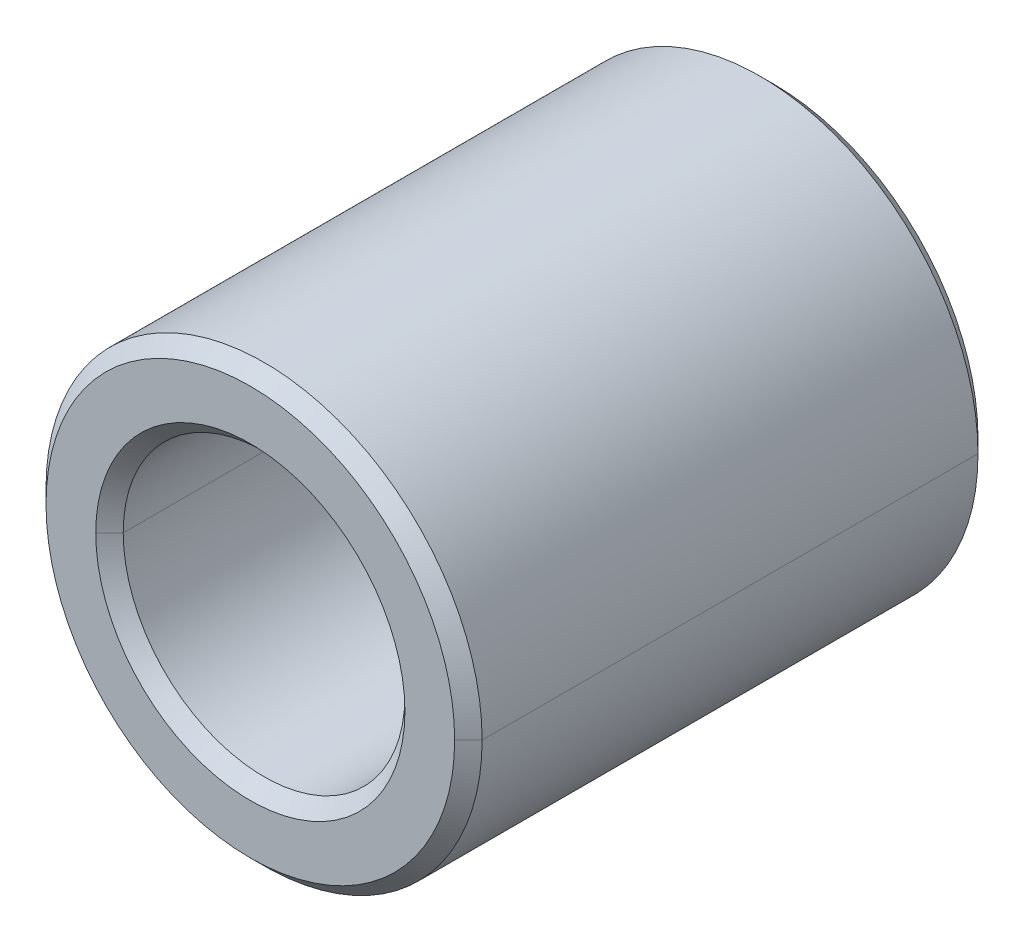
ISO-10303-21;
HEADER;
FILE_DESCRIPTION(('STEP AP214'),'2;1');
FILE_NAME('part.step','',(''),(''),'','','');
FILE_SCHEMA(('AUTOMOTIVE_DESIGN { 1 0 10303 214 1 1 1 1 }'));
ENDSEC;
DATA;
#1=APPLICATION_CONTEXT('core data for automotive mechanical design processes');
#2=APPLICATION_PROTOCOL_DEFINITION('international standard','automotive_design',2000,#1);
#3=PRODUCT_CONTEXT('',#1,'mechanical');
#4=PRODUCT('Part','Part','',(#3));
#5=PRODUCT_RELATED_PRODUCT_CATEGORY('part','',(#4));
#6=PRODUCT_DEFINITION_FORMATION('','',#4);
#7=PRODUCT_DEFINITION_CONTEXT('part definition',#1,'design');
#8=PRODUCT_DEFINITION('design','',#6,#7);
#9=PRODUCT_DEFINITION_SHAPE('','',#8);
#10=(LENGTH_UNIT() NAMED_UNIT(*) SI_UNIT(.MILLI.,.METRE.));
#11=(NAMED_UNIT(*) PLANE_ANGLE_UNIT() SI_UNIT($,.RADIAN.));
#12=(NAMED_UNIT(*) SI_UNIT($,.STERADIAN.) SOLID_ANGLE_UNIT());
#13=UNCERTAINTY_MEASURE_WITH_UNIT(LENGTH_MEASURE(1.E-05),#10,'distance_accuracy_value','');
#14=(GEOMETRIC_REPRESENTATION_CONTEXT(3) GLOBAL_UNCERTAINTY_ASSIGNED_CONTEXT((#13)) GLOBAL_UNIT_ASSIGNED_CONTEXT((#10,
#11,#12)) REPRESENTATION_CONTEXT('',''));
#15=CARTESIAN_POINT('',(0.,0.,0.));
#16=DIRECTION('',(0.,0.,1.));
#17=DIRECTION('',(1.,0.,0.));
#18=AXIS2_PLACEMENT_3D('',#15,#16,#17);
#19=CARTESIAN_POINT('',(0.,0.,9.025));
#20=DIRECTION('',(0.,0.,1.));
#21=DIRECTION('',(1.,0.,0.));
#22=AXIS2_PLACEMENT_3D('',#19,#20,#21);
#23=CONICAL_SURFACE('',#22,5.127,0.785398163397452);
#24=DIRECTION('',(-0.70710678118655,0.,0.707106781186545));
#25=VECTOR('',#24,1.);
#26=CARTESIAN_POINT('',(-5.127,0.,9.025));
#27=LINE('',#26,#25);
#28=CARTESIAN_POINT('',(-5.127,0.,9.025));
#29=VERTEX_POINT('',#28);
#30=CARTESIAN_POINT('',(-5.627,0.,9.525));
#31=VERTEX_POINT('',#30);
#32=EDGE_CURVE('E147',#29,#31,#27,.T.);
#33=ORIENTED_EDGE('',*,*,#32,.F.);
#34=CARTESIAN_POINT('',(0.,0.,9.025));
#35=DIRECTION('',(0.,0.,1.));
#36=DIRECTION('',(1.,0.,0.));
#37=AXIS2_PLACEMENT_3D('',#34,#35,#36);
#38=CIRCLE('',#37,5.127);
#39=CARTESIAN_POINT('',(5.127,0.,9.025));
#40=VERTEX_POINT('',#39);
#41=EDGE_CURVE('E27',#40,#29,#38,.T.);
#42=ORIENTED_EDGE('',*,*,#41,.F.);
#43=DIRECTION('',(0.70710678118655,0.,0.707106781186545));
#44=VECTOR('',#43,1.);
#45=CARTESIAN_POINT('',(5.127,0.,9.025));
#46=LINE('',#45,#44);
#47=CARTESIAN_POINT('',(5.627,0.,9.525));
#48=VERTEX_POINT('',#47);
#49=EDGE_CURVE('E182',#40,#48,#46,.T.);
#50=ORIENTED_EDGE('',*,*,#49,.T.);
#51=CARTESIAN_POINT('',(0.,0.,9.525));
#52=DIRECTION('',(0.,0.,-1.));
#53=DIRECTION('',(1.,0.,0.));
#54=AXIS2_PLACEMENT_3D('',#51,#52,#53);
#55=CIRCLE('',#54,5.627);
#56=EDGE_CURVE('E122',#31,#48,#55,.T.);
#57=ORIENTED_EDGE('',*,*,#56,.F.);
#58=EDGE_LOOP('',(#33,#42,#50,#57));
#59=FACE_BOUND('',#58,.T.);
#60=ADVANCED_FACE('F16',(#59),#23,.F.);
#61=CARTESIAN_POINT('',(0.,0.,9.525));
#62=DIRECTION('',(0.,0.,-1.));
#63=DIRECTION('',(-1.,0.,0.));
#64=AXIS2_PLACEMENT_3D('',#61,#62,#63);
#65=CONICAL_SURFACE('',#64,7.4375,0.785398163397446);
#66=DIRECTION('',(0.707106781186546,0.,-0.707106781186549));
#67=VECTOR('',#66,1.);
#68=CARTESIAN_POINT('',(7.4375,0.,9.525));
#69=LINE('',#68,#67);
#70=CARTESIAN_POINT('',(7.4375,0.,9.525));
#71=VERTEX_POINT('',#70);
#72=CARTESIAN_POINT('',(7.9375,0.,9.025));
#73=VERTEX_POINT('',#72);
#74=EDGE_CURVE('E193',#71,#73,#69,.T.);
#75=ORIENTED_EDGE('',*,*,#74,.F.);
#76=CARTESIAN_POINT('',(0.,0.,9.525));
#77=DIRECTION('',(0.,0.,1.));
#78=DIRECTION('',(1.,0.,0.));
#79=AXIS2_PLACEMENT_3D('',#76,#77,#78);
#80=CIRCLE('',#79,7.4375);
#81=CARTESIAN_POINT('',(-7.4375,0.,9.525));
#82=VERTEX_POINT('',#81);
#83=EDGE_CURVE('E89',#82,#71,#80,.T.);
#84=ORIENTED_EDGE('',*,*,#83,.F.);
#85=DIRECTION('',(-0.707106781186546,0.,-0.707106781186549));
#86=VECTOR('',#85,1.);
#87=CARTESIAN_POINT('',(-7.4375,0.,9.525));
#88=LINE('',#87,#86);
#89=CARTESIAN_POINT('',(-7.9375,0.,9.025));
#90=VERTEX_POINT('',#89);
#91=EDGE_CURVE('E137',#82,#90,#88,.T.);
#92=ORIENTED_EDGE('',*,*,#91,.T.);
#93=CARTESIAN_POINT('',(0.,0.,9.025));
#94=DIRECTION('',(0.,0.,-1.));
#95=DIRECTION('',(1.,0.,0.));
#96=AXIS2_PLACEMENT_3D('',#93,#94,#95);
#97=CIRCLE('',#96,7.9375);
#98=EDGE_CURVE('E99',#73,#90,#97,.T.);
#99=ORIENTED_EDGE('',*,*,#98,.F.);
#100=EDGE_LOOP('',(#75,#84,#92,#99));
#101=FACE_BOUND('',#100,.T.);
#102=ADVANCED_FACE('F318',(#101),#65,.T.);
#103=CARTESIAN_POINT('',(0.,0.,-9.025));
#104=DIRECTION('',(0.,0.,1.));
#105=DIRECTION('',(1.,0.,0.));
#106=AXIS2_PLACEMENT_3D('',#103,#104,#105);
#107=CONICAL_SURFACE('',#106,7.9375,0.785398163397446);
#108=DIRECTION('',(-0.707106781186546,0.,0.707106781186549));
#109=VECTOR('',#108,1.);
#110=CARTESIAN_POINT('',(-7.9375,0.,-9.025));
#111=LINE('',#110,#109);
#112=CARTESIAN_POINT('',(-7.4375,0.,-9.525));
#113=VERTEX_POINT('',#112);
#114=CARTESIAN_POINT('',(-7.9375,0.,-9.025));
#115=VERTEX_POINT('',#114);
#116=EDGE_CURVE('E125',#113,#115,#111,.T.);
#117=ORIENTED_EDGE('',*,*,#116,.F.);
#118=CARTESIAN_POINT('',(0.,0.,-9.525));
#119=DIRECTION('',(0.,0.,-1.));
#120=DIRECTION('',(1.,0.,0.));
#121=AXIS2_PLACEMENT_3D('',#118,#119,#120);
#122=CIRCLE('',#121,7.4375);
#123=CARTESIAN_POINT('',(7.4375,0.,-9.525));
#124=VERTEX_POINT('',#123);
#125=EDGE_CURVE('E110',#124,#113,#122,.T.);
#126=ORIENTED_EDGE('',*,*,#125,.F.);
#127=DIRECTION('',(0.707106781186546,0.,0.707106781186549));
#128=VECTOR('',#127,1.);
#129=CARTESIAN_POINT('',(7.9375,0.,-9.025));
#130=LINE('',#129,#128);
#131=CARTESIAN_POINT('',(7.9375,0.,-9.025));
#132=VERTEX_POINT('',#131);
#133=EDGE_CURVE('E135',#124,#132,#130,.T.);
#134=ORIENTED_EDGE('',*,*,#133,.T.);
#135=CARTESIAN_POINT('',(0.,0.,-9.025));
#136=DIRECTION('',(0.,0.,1.));
#137=DIRECTION('',(1.,0.,0.));
#138=AXIS2_PLACEMENT_3D('',#135,#136,#137);
#139=CIRCLE('',#138,7.9375);
#140=EDGE_CURVE('E127',#115,#132,#139,.T.);
#141=ORIENTED_EDGE('',*,*,#140,.F.);
#142=EDGE_LOOP('',(#117,#126,#134,#141));
#143=FACE_BOUND('',#142,.T.);
#144=ADVANCED_FACE('F126',(#143),#107,.T.);
#145=CARTESIAN_POINT('',(0.,0.,-9.525));
#146=DIRECTION('',(0.,0.,-1.));
#147=DIRECTION('',(-1.,0.,0.));
#148=AXIS2_PLACEMENT_3D('',#145,#146,#147);
#149=CONICAL_SURFACE('',#148,5.627,0.785398163397446);
#150=DIRECTION('',(0.707106781186546,0.,-0.707106781186549));
#151=VECTOR('',#150,1.);
#152=CARTESIAN_POINT('',(5.627,0.,-9.525));
#153=LINE('',#152,#151);
#154=CARTESIAN_POINT('',(5.127,0.,-9.025));
#155=VERTEX_POINT('',#154);
#156=CARTESIAN_POINT('',(5.627,0.,-9.525));
#157=VERTEX_POINT('',#156);
#158=EDGE_CURVE('E178',#155,#157,#153,.T.);
#159=ORIENTED_EDGE('',*,*,#158,.F.);
#160=CARTESIAN_POINT('',(0.,0.,-9.025));
#161=DIRECTION('',(0.,0.,-1.));
#162=DIRECTION('',(1.,0.,0.));
#163=AXIS2_PLACEMENT_3D('',#160,#161,#162);
#164=CIRCLE('',#163,5.127);
#165=CARTESIAN_POINT('',(-5.127,0.,-9.025));
#166=VERTEX_POINT('',#165);
#167=EDGE_CURVE('E11',#166,#155,#164,.T.);
#168=ORIENTED_EDGE('',*,*,#167,.F.);
#169=DIRECTION('',(-0.707106781186546,0.,-0.707106781186549));
#170=VECTOR('',#169,1.);
#171=CARTESIAN_POINT('',(-5.627,0.,-9.525));
#172=LINE('',#171,#170);
#173=CARTESIAN_POINT('',(-5.627,0.,-9.525));
#174=VERTEX_POINT('',#173);
#175=EDGE_CURVE('E161',#166,#174,#172,.T.);
#176=ORIENTED_EDGE('',*,*,#175,.T.);
#177=CARTESIAN_POINT('',(0.,0.,-9.525));
#178=DIRECTION('',(0.,0.,1.));
#179=DIRECTION('',(1.,0.,0.));
#180=AXIS2_PLACEMENT_3D('',#177,#178,#179);
#181=CIRCLE('',#180,5.627);
#182=EDGE_CURVE('E41',#157,#174,#181,.T.);
#183=ORIENTED_EDGE('',*,*,#182,.F.);
#184=EDGE_LOOP('',(#159,#168,#176,#183));
#185=FACE_BOUND('',#184,.T.);
#186=ADVANCED_FACE('F223',(#185),#149,.F.);
#187=CARTESIAN_POINT('',(0.,0.,9.525));
#188=DIRECTION('',(0.,0.,-1.));
#189=DIRECTION('',(-1.,0.,0.));
#190=AXIS2_PLACEMENT_3D('',#187,#188,#189);
#191=CYLINDRICAL_SURFACE('',#190,5.127);
#192=DIRECTION('',(0.,0.,-1.));
#193=VECTOR('',#192,1.);
#194=CARTESIAN_POINT('',(5.127,0.,9.525));
#195=LINE('',#194,#193);
#196=EDGE_CURVE('E160',#40,#155,#195,.T.);
#197=ORIENTED_EDGE('',*,*,#196,.F.);
#198=ORIENTED_EDGE('',*,*,#41,.T.);
#199=DIRECTION('',(0.,0.,-1.));
#200=VECTOR('',#199,1.);
#201=CARTESIAN_POINT('',(-5.127,0.,9.525));
#202=LINE('',#201,#200);
#203=EDGE_CURVE('E156',#29,#166,#202,.T.);
#204=ORIENTED_EDGE('',*,*,#203,.T.);
#205=ORIENTED_EDGE('',*,*,#167,.T.);
#206=EDGE_LOOP('',(#197,#198,#204,#205));
#207=FACE_BOUND('',#206,.T.);
#208=ADVANCED_FACE('F225',(#207),#191,.F.);
#209=CARTESIAN_POINT('',(0.,0.,9.525));
#210=DIRECTION('',(0.,0.,-1.));
#211=DIRECTION('',(-1.,0.,0.));
#212=AXIS2_PLACEMENT_3D('',#209,#210,#211);
#213=CYLINDRICAL_SURFACE('',#212,7.9375);
#214=DIRECTION('',(0.,0.,-1.));
#215=VECTOR('',#214,1.);
#216=CARTESIAN_POINT('',(7.9375,0.,9.525));
#217=LINE('',#216,#215);
#218=EDGE_CURVE('E151',#73,#132,#217,.T.);
#219=ORIENTED_EDGE('',*,*,#218,.F.);
#220=ORIENTED_EDGE('',*,*,#98,.T.);
#221=DIRECTION('',(0.,0.,-1.));
#222=VECTOR('',#221,1.);
#223=CARTESIAN_POINT('',(-7.9375,0.,9.525));
#224=LINE('',#223,#222);
#225=EDGE_CURVE('E155',#90,#115,#224,.T.);
#226=ORIENTED_EDGE('',*,*,#225,.T.);
#227=ORIENTED_EDGE('',*,*,#140,.T.);
#228=EDGE_LOOP('',(#219,#220,#226,#227));
#229=FACE_BOUND('',#228,.T.);
#230=ADVANCED_FACE('F269',(#229),#213,.T.);
#231=CARTESIAN_POINT('',(0.,0.,-9.525));
#232=DIRECTION('',(0.,0.,1.));
#233=DIRECTION('',(1.,0.,0.));
#234=AXIS2_PLACEMENT_3D('',#231,#232,#233);
#235=PLANE('',#234);
#236=CARTESIAN_POINT('',(0.,0.,-9.525));
#237=DIRECTION('',(0.,0.,1.));
#238=DIRECTION('',(1.,0.,0.));
#239=AXIS2_PLACEMENT_3D('',#236,#237,#238);
#240=CIRCLE('',#239,5.627);
#241=EDGE_CURVE('E163',#174,#157,#240,.T.);
#242=ORIENTED_EDGE('',*,*,#241,.T.);
#243=ORIENTED_EDGE('',*,*,#182,.T.);
#244=EDGE_LOOP('',(#242,#243));
#245=FACE_BOUND('',#244,.T.);
#246=ORIENTED_EDGE('',*,*,#125,.T.);
#247=CARTESIAN_POINT('',(0.,0.,-9.525));
#248=DIRECTION('',(0.,0.,-1.));
#249=DIRECTION('',(1.,0.,0.));
#250=AXIS2_PLACEMENT_3D('',#247,#248,#249);
#251=CIRCLE('',#250,7.4375);
#252=EDGE_CURVE('E120',#113,#124,#251,.T.);
#253=ORIENTED_EDGE('',*,*,#252,.T.);
#254=EDGE_LOOP('',(#246,#253));
#255=FACE_BOUND('',#254,.T.);
#256=ADVANCED_FACE('F118',(#245,#255),#235,.F.);
#257=CARTESIAN_POINT('',(0.,0.,9.525));
#258=DIRECTION('',(0.,0.,1.));
#259=DIRECTION('',(1.,0.,0.));
#260=AXIS2_PLACEMENT_3D('',#257,#258,#259);
#261=PLANE('',#260);
#262=CARTESIAN_POINT('',(0.,0.,9.525));
#263=DIRECTION('',(0.,0.,-1.));
#264=DIRECTION('',(1.,0.,0.));
#265=AXIS2_PLACEMENT_3D('',#262,#263,#264);
#266=CIRCLE('',#265,5.627);
#267=EDGE_CURVE('E20',#48,#31,#266,.T.);
#268=ORIENTED_EDGE('',*,*,#267,.T.);
#269=ORIENTED_EDGE('',*,*,#56,.T.);
#270=EDGE_LOOP('',(#268,#269));
#271=FACE_BOUND('',#270,.T.);
#272=ORIENTED_EDGE('',*,*,#83,.T.);
#273=CARTESIAN_POINT('',(0.,0.,9.525));
#274=DIRECTION('',(0.,0.,1.));
#275=DIRECTION('',(1.,0.,0.));
#276=AXIS2_PLACEMENT_3D('',#273,#274,#275);
#277=CIRCLE('',#276,7.4375);
#278=EDGE_CURVE('E186',#71,#82,#277,.T.);
#279=ORIENTED_EDGE('',*,*,#278,.T.);
#280=EDGE_LOOP('',(#272,#279));
#281=FACE_BOUND('',#280,.T.);
#282=ADVANCED_FACE('F246',(#271,#281),#261,.T.);
#283=CARTESIAN_POINT('',(0.,0.,9.525));
#284=DIRECTION('',(0.,0.,-1.));
#285=DIRECTION('',(-1.,0.,0.));
#286=AXIS2_PLACEMENT_3D('',#283,#284,#285);
#287=CYLINDRICAL_SURFACE('',#286,7.9375);
#288=CARTESIAN_POINT('',(0.,0.,9.025));
#289=DIRECTION('',(0.,0.,-1.));
#290=DIRECTION('',(1.,0.,0.));
#291=AXIS2_PLACEMENT_3D('',#288,#289,#290);
#292=CIRCLE('',#291,7.9375);
#293=EDGE_CURVE('E143',#90,#73,#292,.T.);
#294=ORIENTED_EDGE('',*,*,#293,.T.);
#295=ORIENTED_EDGE('',*,*,#218,.T.);
#296=CARTESIAN_POINT('',(0.,0.,-9.025));
#297=DIRECTION('',(0.,0.,1.));
#298=DIRECTION('',(1.,0.,0.));
#299=AXIS2_PLACEMENT_3D('',#296,#297,#298);
#300=CIRCLE('',#299,7.9375);
#301=EDGE_CURVE('E132',#132,#115,#300,.T.);
#302=ORIENTED_EDGE('',*,*,#301,.T.);
#303=ORIENTED_EDGE('',*,*,#225,.F.);
#304=EDGE_LOOP('',(#294,#295,#302,#303));
#305=FACE_BOUND('',#304,.T.);
#306=ADVANCED_FACE('F241',(#305),#287,.T.);
#307=CARTESIAN_POINT('',(0.,0.,9.525));
#308=DIRECTION('',(0.,0.,-1.));
#309=DIRECTION('',(-1.,0.,0.));
#310=AXIS2_PLACEMENT_3D('',#307,#308,#309);
#311=CYLINDRICAL_SURFACE('',#310,5.127);
#312=CARTESIAN_POINT('',(0.,0.,9.025));
#313=DIRECTION('',(0.,0.,1.));
#314=DIRECTION('',(1.,0.,0.));
#315=AXIS2_PLACEMENT_3D('',#312,#313,#314);
#316=CIRCLE('',#315,5.127);
#317=EDGE_CURVE('E150',#29,#40,#316,.T.);
#318=ORIENTED_EDGE('',*,*,#317,.T.);
#319=ORIENTED_EDGE('',*,*,#196,.T.);
#320=CARTESIAN_POINT('',(0.,0.,-9.025));
#321=DIRECTION('',(0.,0.,-1.));
#322=DIRECTION('',(1.,0.,0.));
#323=AXIS2_PLACEMENT_3D('',#320,#321,#322);
#324=CIRCLE('',#323,5.127);
#325=EDGE_CURVE('E181',#155,#166,#324,.T.);
#326=ORIENTED_EDGE('',*,*,#325,.T.);
#327=ORIENTED_EDGE('',*,*,#203,.F.);
#328=EDGE_LOOP('',(#318,#319,#326,#327));
#329=FACE_BOUND('',#328,.T.);
#330=ADVANCED_FACE('F214',(#329),#311,.F.);
#331=CARTESIAN_POINT('',(0.,0.,-9.525));
#332=DIRECTION('',(0.,0.,-1.));
#333=DIRECTION('',(-1.,0.,0.));
#334=AXIS2_PLACEMENT_3D('',#331,#332,#333);
#335=CONICAL_SURFACE('',#334,5.627,0.785398163397446);
#336=ORIENTED_EDGE('',*,*,#325,.F.);
#337=ORIENTED_EDGE('',*,*,#158,.T.);
#338=ORIENTED_EDGE('',*,*,#241,.F.);
#339=ORIENTED_EDGE('',*,*,#175,.F.);
#340=EDGE_LOOP('',(#336,#337,#338,#339));
#341=FACE_BOUND('',#340,.T.);
#342=ADVANCED_FACE('F220',(#341),#335,.F.);
#343=CARTESIAN_POINT('',(0.,0.,-9.025));
#344=DIRECTION('',(0.,0.,1.));
#345=DIRECTION('',(1.,0.,0.));
#346=AXIS2_PLACEMENT_3D('',#343,#344,#345);
#347=CONICAL_SURFACE('',#346,7.9375,0.785398163397446);
#348=ORIENTED_EDGE('',*,*,#252,.F.);
#349=ORIENTED_EDGE('',*,*,#116,.T.);
#350=ORIENTED_EDGE('',*,*,#301,.F.);
#351=ORIENTED_EDGE('',*,*,#133,.F.);
#352=EDGE_LOOP('',(#348,#349,#350,#351));
#353=FACE_BOUND('',#352,.T.);
#354=ADVANCED_FACE('F134',(#353),#347,.T.);
#355=CARTESIAN_POINT('',(0.,0.,9.525));
#356=DIRECTION('',(0.,0.,-1.));
#357=DIRECTION('',(-1.,0.,0.));
#358=AXIS2_PLACEMENT_3D('',#355,#356,#357);
#359=CONICAL_SURFACE('',#358,7.4375,0.785398163397446);
#360=ORIENTED_EDGE('',*,*,#278,.F.);
#361=ORIENTED_EDGE('',*,*,#74,.T.);
#362=ORIENTED_EDGE('',*,*,#293,.F.);
#363=ORIENTED_EDGE('',*,*,#91,.F.);
#364=EDGE_LOOP('',(#360,#361,#362,#363));
#365=FACE_BOUND('',#364,.T.);
#366=ADVANCED_FACE('F291',(#365),#359,.T.);
#367=CARTESIAN_POINT('',(0.,0.,9.025));
#368=DIRECTION('',(0.,0.,1.));
#369=DIRECTION('',(1.,0.,0.));
#370=AXIS2_PLACEMENT_3D('',#367,#368,#369);
#371=CONICAL_SURFACE('',#370,5.127,0.785398163397452);
#372=ORIENTED_EDGE('',*,*,#317,.F.);
#373=ORIENTED_EDGE('',*,*,#32,.T.);
#374=ORIENTED_EDGE('',*,*,#267,.F.);
#375=ORIENTED_EDGE('',*,*,#49,.F.);
#376=EDGE_LOOP('',(#372,#373,#374,#375));
#377=FACE_BOUND('',#376,.T.);
#378=ADVANCED_FACE('F18',(#377),#371,.F.);
#379=CLOSED_SHELL('',(#60,#102,#144,#186,#208,#230,#256,#282,#306,#330,#342,#354,#366,#378));
#380=MANIFOLD_SOLID_BREP('B1',#379);
#381=ADVANCED_BREP_SHAPE_REPRESENTATION('',(#18,#380),#14);
#382=SHAPE_DEFINITION_REPRESENTATION(#9,#381);
ENDSEC;
END-ISO-10303-21;
